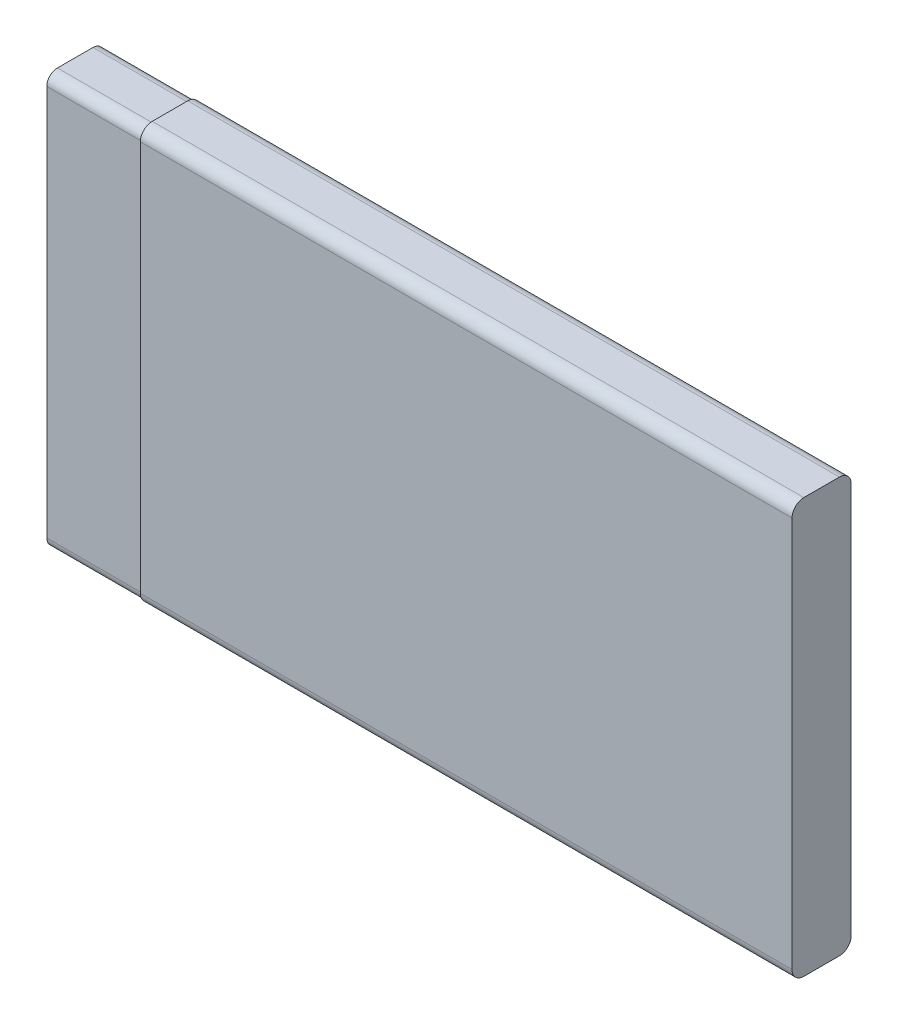
ISO-10303-21;
HEADER;
FILE_DESCRIPTION(('STEP AP214'),'2;1');
FILE_NAME('part.step','',(''),(''),'','','');
FILE_SCHEMA(('AUTOMOTIVE_DESIGN { 1 0 10303 214 1 1 1 1 }'));
ENDSEC;
DATA;
#1=APPLICATION_CONTEXT('core data for automotive mechanical design processes');
#2=APPLICATION_PROTOCOL_DEFINITION('international standard','automotive_design',2000,#1);
#3=PRODUCT_CONTEXT('',#1,'mechanical');
#4=PRODUCT('Part','Part','',(#3));
#5=PRODUCT_RELATED_PRODUCT_CATEGORY('part','',(#4));
#6=PRODUCT_DEFINITION_FORMATION('','',#4);
#7=PRODUCT_DEFINITION_CONTEXT('part definition',#1,'design');
#8=PRODUCT_DEFINITION('design','',#6,#7);
#9=PRODUCT_DEFINITION_SHAPE('','',#8);
#10=(LENGTH_UNIT() NAMED_UNIT(*) SI_UNIT(.MILLI.,.METRE.));
#11=(NAMED_UNIT(*) PLANE_ANGLE_UNIT() SI_UNIT($,.RADIAN.));
#12=(NAMED_UNIT(*) SI_UNIT($,.STERADIAN.) SOLID_ANGLE_UNIT());
#13=UNCERTAINTY_MEASURE_WITH_UNIT(LENGTH_MEASURE(1.E-05),#10,'distance_accuracy_value','');
#14=(GEOMETRIC_REPRESENTATION_CONTEXT(3) GLOBAL_UNCERTAINTY_ASSIGNED_CONTEXT((#13)) GLOBAL_UNIT_ASSIGNED_CONTEXT((#10,
#11,#12)) REPRESENTATION_CONTEXT('',''));
#15=CARTESIAN_POINT('',(0.,0.,0.));
#16=DIRECTION('',(0.,0.,1.));
#17=DIRECTION('',(1.,0.,0.));
#18=AXIS2_PLACEMENT_3D('',#15,#16,#17);
#19=CARTESIAN_POINT('',(-23.5,17.5,2.5));
#20=DIRECTION('',(1.,0.,0.));
#21=DIRECTION('',(0.,1.,0.));
#22=AXIS2_PLACEMENT_3D('',#19,#20,#21);
#23=PLANE('',#22);
#24=DIRECTION('',(0.,0.,-1.));
#25=VECTOR('',#24,1.);
#26=CARTESIAN_POINT('',(-23.5,-17.5,2.5));
#27=LINE('',#26,#25);
#28=CARTESIAN_POINT('',(-23.5,-17.5,1.5));
#29=VERTEX_POINT('',#28);
#30=CARTESIAN_POINT('',(-23.5,-17.5,-1.5));
#31=VERTEX_POINT('',#30);
#32=EDGE_CURVE('E390',#29,#31,#27,.T.);
#33=ORIENTED_EDGE('',*,*,#32,.F.);
#34=CARTESIAN_POINT('',(-23.5,-16.5,1.5));
#35=DIRECTION('',(1.,0.,0.));
#36=DIRECTION('',(0.,1.,0.));
#37=AXIS2_PLACEMENT_3D('',#34,#35,#36);
#38=CIRCLE('',#37,1.);
#39=CARTESIAN_POINT('',(-23.5,-16.5,2.5));
#40=VERTEX_POINT('',#39);
#41=EDGE_CURVE('E431',#29,#40,#38,.F.);
#42=ORIENTED_EDGE('',*,*,#41,.T.);
#43=DIRECTION('',(0.,-1.,0.));
#44=VECTOR('',#43,1.);
#45=CARTESIAN_POINT('',(-23.5,17.5,2.5));
#46=LINE('',#45,#44);
#47=CARTESIAN_POINT('',(-23.5,16.5,2.5));
#48=VERTEX_POINT('',#47);
#49=EDGE_CURVE('E386',#48,#40,#46,.T.);
#50=ORIENTED_EDGE('',*,*,#49,.F.);
#51=CARTESIAN_POINT('',(-23.5,16.5,1.5));
#52=DIRECTION('',(1.,0.,0.));
#53=DIRECTION('',(0.,1.,0.));
#54=AXIS2_PLACEMENT_3D('',#51,#52,#53);
#55=CIRCLE('',#54,1.);
#56=CARTESIAN_POINT('',(-23.5,17.5,1.5));
#57=VERTEX_POINT('',#56);
#58=EDGE_CURVE('E425',#48,#57,#55,.F.);
#59=ORIENTED_EDGE('',*,*,#58,.T.);
#60=DIRECTION('',(0.,0.,-1.));
#61=VECTOR('',#60,1.);
#62=CARTESIAN_POINT('',(-23.5,17.5,2.5));
#63=LINE('',#62,#61);
#64=CARTESIAN_POINT('',(-23.5,17.5,-1.5));
#65=VERTEX_POINT('',#64);
#66=EDGE_CURVE('E397',#57,#65,#63,.T.);
#67=ORIENTED_EDGE('',*,*,#66,.T.);
#68=CARTESIAN_POINT('',(-23.5,16.5,-1.5));
#69=DIRECTION('',(1.,0.,0.));
#70=DIRECTION('',(0.,1.,0.));
#71=AXIS2_PLACEMENT_3D('',#68,#69,#70);
#72=CIRCLE('',#71,1.);
#73=CARTESIAN_POINT('',(-23.5,16.5,-2.5));
#74=VERTEX_POINT('',#73);
#75=EDGE_CURVE('E427',#65,#74,#72,.F.);
#76=ORIENTED_EDGE('',*,*,#75,.T.);
#77=DIRECTION('',(0.,-1.,0.));
#78=VECTOR('',#77,1.);
#79=CARTESIAN_POINT('',(-23.5,17.5,-2.5));
#80=LINE('',#79,#78);
#81=CARTESIAN_POINT('',(-23.5,-16.5,-2.5));
#82=VERTEX_POINT('',#81);
#83=EDGE_CURVE('E387',#74,#82,#80,.T.);
#84=ORIENTED_EDGE('',*,*,#83,.T.);
#85=CARTESIAN_POINT('',(-23.5,-16.5,-1.5));
#86=DIRECTION('',(1.,0.,0.));
#87=DIRECTION('',(0.,1.,0.));
#88=AXIS2_PLACEMENT_3D('',#85,#86,#87);
#89=CIRCLE('',#88,1.);
#90=EDGE_CURVE('E429',#82,#31,#89,.F.);
#91=ORIENTED_EDGE('',*,*,#90,.T.);
#92=EDGE_LOOP('',(#33,#42,#50,#59,#67,#76,#84,#91));
#93=FACE_BOUND('',#92,.T.);
#94=CARTESIAN_POINT('',(-23.5,-16.5,-1.5));
#95=DIRECTION('',(-1.,0.,0.));
#96=DIRECTION('',(0.,-1.,0.));
#97=AXIS2_PLACEMENT_3D('',#94,#95,#96);
#98=CIRCLE('',#97,0.899999999999999);
#99=CARTESIAN_POINT('',(-23.5,-16.5,-2.4));
#100=VERTEX_POINT('',#99);
#101=CARTESIAN_POINT('',(-23.5,-17.4,-1.5));
#102=VERTEX_POINT('',#101);
#103=EDGE_CURVE('E239',#100,#102,#98,.T.);
#104=ORIENTED_EDGE('',*,*,#103,.F.);
#105=DIRECTION('',(0.,-1.,0.));
#106=VECTOR('',#105,1.);
#107=CARTESIAN_POINT('',(-23.5,16.5,-2.4));
#108=LINE('',#107,#106);
#109=CARTESIAN_POINT('',(-23.5,16.5,-2.4));
#110=VERTEX_POINT('',#109);
#111=EDGE_CURVE('E296',#110,#100,#108,.T.);
#112=ORIENTED_EDGE('',*,*,#111,.F.);
#113=CARTESIAN_POINT('',(-23.5,16.5,-1.5));
#114=DIRECTION('',(-1.,0.,0.));
#115=DIRECTION('',(0.,-1.,0.));
#116=AXIS2_PLACEMENT_3D('',#113,#114,#115);
#117=CIRCLE('',#116,0.900000000000001);
#118=CARTESIAN_POINT('',(-23.5,17.4,-1.5));
#119=VERTEX_POINT('',#118);
#120=EDGE_CURVE('E324',#119,#110,#117,.T.);
#121=ORIENTED_EDGE('',*,*,#120,.F.);
#122=DIRECTION('',(0.,0.,-1.));
#123=VECTOR('',#122,1.);
#124=CARTESIAN_POINT('',(-23.5,17.4,1.5));
#125=LINE('',#124,#123);
#126=CARTESIAN_POINT('',(-23.5,17.4,1.5));
#127=VERTEX_POINT('',#126);
#128=EDGE_CURVE('E321',#127,#119,#125,.T.);
#129=ORIENTED_EDGE('',*,*,#128,.F.);
#130=CARTESIAN_POINT('',(-23.5,16.5,1.5));
#131=DIRECTION('',(-1.,0.,0.));
#132=DIRECTION('',(0.,-1.,0.));
#133=AXIS2_PLACEMENT_3D('',#130,#131,#132);
#134=CIRCLE('',#133,0.900000000000001);
#135=CARTESIAN_POINT('',(-23.5,16.5,2.4));
#136=VERTEX_POINT('',#135);
#137=EDGE_CURVE('E318',#136,#127,#134,.T.);
#138=ORIENTED_EDGE('',*,*,#137,.F.);
#139=DIRECTION('',(0.,1.,0.));
#140=VECTOR('',#139,1.);
#141=CARTESIAN_POINT('',(-23.5,-16.5,2.4));
#142=LINE('',#141,#140);
#143=CARTESIAN_POINT('',(-23.5,-16.5,2.4));
#144=VERTEX_POINT('',#143);
#145=EDGE_CURVE('E315',#144,#136,#142,.T.);
#146=ORIENTED_EDGE('',*,*,#145,.F.);
#147=CARTESIAN_POINT('',(-23.5,-16.5,1.5));
#148=DIRECTION('',(-1.,0.,0.));
#149=DIRECTION('',(0.,-1.,0.));
#150=AXIS2_PLACEMENT_3D('',#147,#148,#149);
#151=CIRCLE('',#150,0.900000000000001);
#152=CARTESIAN_POINT('',(-23.5,-17.4,1.5));
#153=VERTEX_POINT('',#152);
#154=EDGE_CURVE('E57',#153,#144,#151,.T.);
#155=ORIENTED_EDGE('',*,*,#154,.F.);
#156=DIRECTION('',(0.,0.,1.));
#157=VECTOR('',#156,1.);
#158=CARTESIAN_POINT('',(-23.5,-17.4,-1.5));
#159=LINE('',#158,#157);
#160=EDGE_CURVE('E52',#102,#153,#159,.T.);
#161=ORIENTED_EDGE('',*,*,#160,.F.);
#162=EDGE_LOOP('',(#104,#112,#121,#129,#138,#146,#155,#161));
#163=FACE_BOUND('',#162,.T.);
#164=ADVANCED_FACE('F37',(#93,#163),#23,.F.);
#165=CARTESIAN_POINT('',(31.5,-17.5,2.5));
#166=DIRECTION('',(0.,1.,0.));
#167=DIRECTION('',(-1.,0.,0.));
#168=AXIS2_PLACEMENT_3D('',#165,#166,#167);
#169=PLANE('',#168);
#170=DIRECTION('',(0.,0.,-1.));
#171=VECTOR('',#170,1.);
#172=CARTESIAN_POINT('',(31.5,-17.5,2.5));
#173=LINE('',#172,#171);
#174=CARTESIAN_POINT('',(31.5,-17.5,1.5));
#175=VERTEX_POINT('',#174);
#176=CARTESIAN_POINT('',(31.5,-17.5,-1.5));
#177=VERTEX_POINT('',#176);
#178=EDGE_CURVE('E403',#175,#177,#173,.T.);
#179=ORIENTED_EDGE('',*,*,#178,.F.);
#180=DIRECTION('',(1.,0.,0.));
#181=VECTOR('',#180,1.);
#182=CARTESIAN_POINT('',(-23.5,-17.5,1.5));
#183=LINE('',#182,#181);
#184=EDGE_CURVE('E423',#175,#29,#183,.F.);
#185=ORIENTED_EDGE('',*,*,#184,.T.);
#186=ORIENTED_EDGE('',*,*,#32,.T.);
#187=DIRECTION('',(1.,0.,0.));
#188=VECTOR('',#187,1.);
#189=CARTESIAN_POINT('',(31.5,-17.5,-1.5));
#190=LINE('',#189,#188);
#191=EDGE_CURVE('E420',#31,#177,#190,.T.);
#192=ORIENTED_EDGE('',*,*,#191,.T.);
#193=EDGE_LOOP('',(#179,#185,#186,#192));
#194=FACE_BOUND('',#193,.T.);
#195=ADVANCED_FACE('F461',(#194),#169,.F.);
#196=CARTESIAN_POINT('',(31.5,17.5,2.5));
#197=DIRECTION('',(-1.,0.,0.));
#198=DIRECTION('',(0.,-1.,0.));
#199=AXIS2_PLACEMENT_3D('',#196,#197,#198);
#200=PLANE('',#199);
#201=DIRECTION('',(0.,1.,0.));
#202=VECTOR('',#201,1.);
#203=CARTESIAN_POINT('',(31.5,17.5,2.5));
#204=LINE('',#203,#202);
#205=CARTESIAN_POINT('',(31.5,-16.5,2.5));
#206=VERTEX_POINT('',#205);
#207=CARTESIAN_POINT('',(31.5,16.5,2.5));
#208=VERTEX_POINT('',#207);
#209=EDGE_CURVE('E383',#206,#208,#204,.T.);
#210=ORIENTED_EDGE('',*,*,#209,.F.);
#211=CARTESIAN_POINT('',(31.5,-16.5,1.5));
#212=DIRECTION('',(-1.,0.,0.));
#213=DIRECTION('',(0.,-1.,0.));
#214=AXIS2_PLACEMENT_3D('',#211,#212,#213);
#215=CIRCLE('',#214,1.);
#216=EDGE_CURVE('E418',#206,#175,#215,.F.);
#217=ORIENTED_EDGE('',*,*,#216,.T.);
#218=ORIENTED_EDGE('',*,*,#178,.T.);
#219=CARTESIAN_POINT('',(31.5,-16.5,-1.5));
#220=DIRECTION('',(-1.,0.,0.));
#221=DIRECTION('',(0.,-1.,0.));
#222=AXIS2_PLACEMENT_3D('',#219,#220,#221);
#223=CIRCLE('',#222,1.);
#224=CARTESIAN_POINT('',(31.5,-16.5,-2.5));
#225=VERTEX_POINT('',#224);
#226=EDGE_CURVE('E416',#177,#225,#223,.F.);
#227=ORIENTED_EDGE('',*,*,#226,.T.);
#228=DIRECTION('',(0.,1.,0.));
#229=VECTOR('',#228,1.);
#230=CARTESIAN_POINT('',(31.5,17.5,-2.5));
#231=LINE('',#230,#229);
#232=CARTESIAN_POINT('',(31.5,16.5,-2.5));
#233=VERTEX_POINT('',#232);
#234=EDGE_CURVE('E382',#225,#233,#231,.T.);
#235=ORIENTED_EDGE('',*,*,#234,.T.);
#236=CARTESIAN_POINT('',(31.5,16.5,-1.5));
#237=DIRECTION('',(-1.,0.,0.));
#238=DIRECTION('',(0.,-1.,0.));
#239=AXIS2_PLACEMENT_3D('',#236,#237,#238);
#240=CIRCLE('',#239,1.);
#241=CARTESIAN_POINT('',(31.5,17.5,-1.5));
#242=VERTEX_POINT('',#241);
#243=EDGE_CURVE('E414',#233,#242,#240,.F.);
#244=ORIENTED_EDGE('',*,*,#243,.T.);
#245=DIRECTION('',(0.,0.,-1.));
#246=VECTOR('',#245,1.);
#247=CARTESIAN_POINT('',(31.5,17.5,2.5));
#248=LINE('',#247,#246);
#249=CARTESIAN_POINT('',(31.5,17.5,1.5));
#250=VERTEX_POINT('',#249);
#251=EDGE_CURVE('E400',#250,#242,#248,.T.);
#252=ORIENTED_EDGE('',*,*,#251,.F.);
#253=CARTESIAN_POINT('',(31.5,16.5,1.5));
#254=DIRECTION('',(-1.,0.,0.));
#255=DIRECTION('',(0.,-1.,0.));
#256=AXIS2_PLACEMENT_3D('',#253,#254,#255);
#257=CIRCLE('',#256,1.);
#258=EDGE_CURVE('E412',#250,#208,#257,.F.);
#259=ORIENTED_EDGE('',*,*,#258,.T.);
#260=EDGE_LOOP('',(#210,#217,#218,#227,#235,#244,#252,#259));
#261=FACE_BOUND('',#260,.T.);
#262=ADVANCED_FACE('F446',(#261),#200,.F.);
#263=CARTESIAN_POINT('',(31.5,17.5,2.5));
#264=DIRECTION('',(0.,-1.,0.));
#265=DIRECTION('',(1.,0.,0.));
#266=AXIS2_PLACEMENT_3D('',#263,#264,#265);
#267=PLANE('',#266);
#268=ORIENTED_EDGE('',*,*,#251,.T.);
#269=DIRECTION('',(-1.,0.,0.));
#270=VECTOR('',#269,1.);
#271=CARTESIAN_POINT('',(31.5,17.5,-1.5));
#272=LINE('',#271,#270);
#273=EDGE_CURVE('E11',#242,#65,#272,.T.);
#274=ORIENTED_EDGE('',*,*,#273,.T.);
#275=ORIENTED_EDGE('',*,*,#66,.F.);
#276=DIRECTION('',(-1.,0.,0.));
#277=VECTOR('',#276,1.);
#278=CARTESIAN_POINT('',(31.5,17.5,1.5));
#279=LINE('',#278,#277);
#280=EDGE_CURVE('E45',#57,#250,#279,.F.);
#281=ORIENTED_EDGE('',*,*,#280,.T.);
#282=EDGE_LOOP('',(#268,#274,#275,#281));
#283=FACE_BOUND('',#282,.T.);
#284=ADVANCED_FACE('F440',(#283),#267,.F.);
#285=CARTESIAN_POINT('',(0.,0.,2.5));
#286=DIRECTION('',(0.,0.,1.));
#287=DIRECTION('',(1.,0.,0.));
#288=AXIS2_PLACEMENT_3D('',#285,#286,#287);
#289=PLANE('',#288);
#290=ORIENTED_EDGE('',*,*,#49,.T.);
#291=DIRECTION('',(1.,0.,0.));
#292=VECTOR('',#291,1.);
#293=CARTESIAN_POINT('',(31.5,-16.5,2.5));
#294=LINE('',#293,#292);
#295=EDGE_CURVE('E409',#40,#206,#294,.T.);
#296=ORIENTED_EDGE('',*,*,#295,.T.);
#297=ORIENTED_EDGE('',*,*,#209,.T.);
#298=DIRECTION('',(-1.,0.,0.));
#299=VECTOR('',#298,1.);
#300=CARTESIAN_POINT('',(-23.5,16.5,2.5));
#301=LINE('',#300,#299);
#302=EDGE_CURVE('E406',#208,#48,#301,.T.);
#303=ORIENTED_EDGE('',*,*,#302,.T.);
#304=EDGE_LOOP('',(#290,#296,#297,#303));
#305=FACE_BOUND('',#304,.T.);
#306=ADVANCED_FACE('F451',(#305),#289,.T.);
#307=CARTESIAN_POINT('',(0.,0.,-2.5));
#308=DIRECTION('',(0.,0.,1.));
#309=DIRECTION('',(1.,0.,0.));
#310=AXIS2_PLACEMENT_3D('',#307,#308,#309);
#311=PLANE('',#310);
#312=ORIENTED_EDGE('',*,*,#234,.F.);
#313=DIRECTION('',(1.,0.,0.));
#314=VECTOR('',#313,1.);
#315=CARTESIAN_POINT('',(0.,-16.5,-2.5));
#316=LINE('',#315,#314);
#317=EDGE_CURVE('E435',#225,#82,#316,.F.);
#318=ORIENTED_EDGE('',*,*,#317,.T.);
#319=ORIENTED_EDGE('',*,*,#83,.F.);
#320=DIRECTION('',(-1.,0.,0.));
#321=VECTOR('',#320,1.);
#322=CARTESIAN_POINT('',(0.,16.5,-2.5));
#323=LINE('',#322,#321);
#324=EDGE_CURVE('E433',#74,#233,#323,.F.);
#325=ORIENTED_EDGE('',*,*,#324,.T.);
#326=EDGE_LOOP('',(#312,#318,#319,#325));
#327=FACE_BOUND('',#326,.T.);
#328=ADVANCED_FACE('F469',(#327),#311,.F.);
#329=CARTESIAN_POINT('',(0.,-16.5,1.5));
#330=DIRECTION('',(-1.,0.,0.));
#331=DIRECTION('',(0.,-1.,0.));
#332=AXIS2_PLACEMENT_3D('',#329,#330,#331);
#333=CYLINDRICAL_SURFACE('',#332,1.);
#334=ORIENTED_EDGE('',*,*,#41,.F.);
#335=ORIENTED_EDGE('',*,*,#184,.F.);
#336=ORIENTED_EDGE('',*,*,#216,.F.);
#337=ORIENTED_EDGE('',*,*,#295,.F.);
#338=EDGE_LOOP('',(#334,#335,#336,#337));
#339=FACE_BOUND('',#338,.T.);
#340=ADVANCED_FACE('F458',(#339),#333,.T.);
#341=CARTESIAN_POINT('',(31.5,-16.5,-1.5));
#342=DIRECTION('',(1.,0.,0.));
#343=DIRECTION('',(0.,1.,0.));
#344=AXIS2_PLACEMENT_3D('',#341,#342,#343);
#345=CYLINDRICAL_SURFACE('',#344,1.);
#346=ORIENTED_EDGE('',*,*,#90,.F.);
#347=ORIENTED_EDGE('',*,*,#317,.F.);
#348=ORIENTED_EDGE('',*,*,#226,.F.);
#349=ORIENTED_EDGE('',*,*,#191,.F.);
#350=EDGE_LOOP('',(#346,#347,#348,#349));
#351=FACE_BOUND('',#350,.T.);
#352=ADVANCED_FACE('F465',(#351),#345,.T.);
#353=CARTESIAN_POINT('',(31.5,16.5,-1.5));
#354=DIRECTION('',(-1.,0.,0.));
#355=DIRECTION('',(0.,-1.,0.));
#356=AXIS2_PLACEMENT_3D('',#353,#354,#355);
#357=CYLINDRICAL_SURFACE('',#356,1.);
#358=ORIENTED_EDGE('',*,*,#243,.F.);
#359=ORIENTED_EDGE('',*,*,#324,.F.);
#360=ORIENTED_EDGE('',*,*,#75,.F.);
#361=ORIENTED_EDGE('',*,*,#273,.F.);
#362=EDGE_LOOP('',(#358,#359,#360,#361));
#363=FACE_BOUND('',#362,.T.);
#364=ADVANCED_FACE('F473',(#363),#357,.T.);
#365=CARTESIAN_POINT('',(0.,16.5,1.5));
#366=DIRECTION('',(1.,0.,0.));
#367=DIRECTION('',(0.,1.,0.));
#368=AXIS2_PLACEMENT_3D('',#365,#366,#367);
#369=CYLINDRICAL_SURFACE('',#368,1.);
#370=ORIENTED_EDGE('',*,*,#258,.F.);
#371=ORIENTED_EDGE('',*,*,#280,.F.);
#372=ORIENTED_EDGE('',*,*,#58,.F.);
#373=ORIENTED_EDGE('',*,*,#302,.F.);
#374=EDGE_LOOP('',(#370,#371,#372,#373));
#375=FACE_BOUND('',#374,.T.);
#376=ADVANCED_FACE('F39',(#375),#369,.T.);
#377=CARTESIAN_POINT('',(-31.5,-16.5,-1.5));
#378=DIRECTION('',(-1.,0.,0.));
#379=DIRECTION('',(0.,-1.,0.));
#380=AXIS2_PLACEMENT_3D('',#377,#378,#379);
#381=PLANE('',#380);
#382=CARTESIAN_POINT('',(-31.5,-16.5,-1.5));
#383=DIRECTION('',(-1.,0.,0.));
#384=DIRECTION('',(0.,-1.,0.));
#385=AXIS2_PLACEMENT_3D('',#382,#383,#384);
#386=CIRCLE('',#385,0.899999999999999);
#387=CARTESIAN_POINT('',(-31.5,-16.5,-2.4));
#388=VERTEX_POINT('',#387);
#389=CARTESIAN_POINT('',(-31.5,-17.4,-1.5));
#390=VERTEX_POINT('',#389);
#391=EDGE_CURVE('E292',#388,#390,#386,.T.);
#392=ORIENTED_EDGE('',*,*,#391,.T.);
#393=DIRECTION('',(0.,0.,1.));
#394=VECTOR('',#393,1.);
#395=CARTESIAN_POINT('',(-31.5,-17.4,-1.5));
#396=LINE('',#395,#394);
#397=CARTESIAN_POINT('',(-31.5,-17.4,1.5));
#398=VERTEX_POINT('',#397);
#399=EDGE_CURVE('E295',#390,#398,#396,.T.);
#400=ORIENTED_EDGE('',*,*,#399,.T.);
#401=CARTESIAN_POINT('',(-31.5,-16.5,1.5));
#402=DIRECTION('',(-1.,0.,0.));
#403=DIRECTION('',(0.,-1.,0.));
#404=AXIS2_PLACEMENT_3D('',#401,#402,#403);
#405=CIRCLE('',#404,0.900000000000001);
#406=CARTESIAN_POINT('',(-31.5,-16.5,2.4));
#407=VERTEX_POINT('',#406);
#408=EDGE_CURVE('E298',#398,#407,#405,.T.);
#409=ORIENTED_EDGE('',*,*,#408,.T.);
#410=DIRECTION('',(0.,1.,0.));
#411=VECTOR('',#410,1.);
#412=CARTESIAN_POINT('',(-31.5,-16.5,2.4));
#413=LINE('',#412,#411);
#414=CARTESIAN_POINT('',(-31.5,16.5,2.4));
#415=VERTEX_POINT('',#414);
#416=EDGE_CURVE('E300',#407,#415,#413,.T.);
#417=ORIENTED_EDGE('',*,*,#416,.T.);
#418=CARTESIAN_POINT('',(-31.5,16.5,1.5));
#419=DIRECTION('',(-1.,0.,0.));
#420=DIRECTION('',(0.,-1.,0.));
#421=AXIS2_PLACEMENT_3D('',#418,#419,#420);
#422=CIRCLE('',#421,0.900000000000001);
#423=CARTESIAN_POINT('',(-31.5,17.4,1.5));
#424=VERTEX_POINT('',#423);
#425=EDGE_CURVE('E302',#415,#424,#422,.T.);
#426=ORIENTED_EDGE('',*,*,#425,.T.);
#427=DIRECTION('',(0.,0.,-1.));
#428=VECTOR('',#427,1.);
#429=CARTESIAN_POINT('',(-31.5,17.4,1.5));
#430=LINE('',#429,#428);
#431=CARTESIAN_POINT('',(-31.5,17.4,-1.5));
#432=VERTEX_POINT('',#431);
#433=EDGE_CURVE('E304',#424,#432,#430,.T.);
#434=ORIENTED_EDGE('',*,*,#433,.T.);
#435=CARTESIAN_POINT('',(-31.5,16.5,-1.5));
#436=DIRECTION('',(-1.,0.,0.));
#437=DIRECTION('',(0.,-1.,0.));
#438=AXIS2_PLACEMENT_3D('',#435,#436,#437);
#439=CIRCLE('',#438,0.900000000000001);
#440=CARTESIAN_POINT('',(-31.5,16.5,-2.4));
#441=VERTEX_POINT('',#440);
#442=EDGE_CURVE('E306',#432,#441,#439,.T.);
#443=ORIENTED_EDGE('',*,*,#442,.T.);
#444=DIRECTION('',(0.,-1.,0.));
#445=VECTOR('',#444,1.);
#446=CARTESIAN_POINT('',(-31.5,16.5,-2.4));
#447=LINE('',#446,#445);
#448=EDGE_CURVE('E308',#441,#388,#447,.T.);
#449=ORIENTED_EDGE('',*,*,#448,.T.);
#450=EDGE_LOOP('',(#392,#400,#409,#417,#426,#434,#443,#449));
#451=FACE_BOUND('',#450,.T.);
#452=DIRECTION('',(0.,0.,1.));
#453=VECTOR('',#452,1.);
#454=CARTESIAN_POINT('',(-31.5,-17.3,-1.5));
#455=LINE('',#454,#453);
#456=CARTESIAN_POINT('',(-31.5,-17.3,-1.5));
#457=VERTEX_POINT('',#456);
#458=CARTESIAN_POINT('',(-31.5,-17.3,1.5));
#459=VERTEX_POINT('',#458);
#460=EDGE_CURVE('E231',#457,#459,#455,.T.);
#461=ORIENTED_EDGE('',*,*,#460,.F.);
#462=CARTESIAN_POINT('',(-31.5,-16.5,-1.5));
#463=DIRECTION('',(-1.,0.,0.));
#464=DIRECTION('',(0.,-1.,0.));
#465=AXIS2_PLACEMENT_3D('',#462,#463,#464);
#466=CIRCLE('',#465,0.799999999999999);
#467=CARTESIAN_POINT('',(-31.5,-16.5,-2.3));
#468=VERTEX_POINT('',#467);
#469=EDGE_CURVE('E221',#468,#457,#466,.T.);
#470=ORIENTED_EDGE('',*,*,#469,.F.);
#471=DIRECTION('',(0.,-1.,0.));
#472=VECTOR('',#471,1.);
#473=CARTESIAN_POINT('',(-31.5,16.5,-2.3));
#474=LINE('',#473,#472);
#475=CARTESIAN_POINT('',(-31.5,16.5,-2.3));
#476=VERTEX_POINT('',#475);
#477=EDGE_CURVE('E258',#476,#468,#474,.T.);
#478=ORIENTED_EDGE('',*,*,#477,.F.);
#479=CARTESIAN_POINT('',(-31.5,16.5,-1.5));
#480=DIRECTION('',(-1.,0.,0.));
#481=DIRECTION('',(0.,-1.,0.));
#482=AXIS2_PLACEMENT_3D('',#479,#480,#481);
#483=CIRCLE('',#482,0.800000000000001);
#484=CARTESIAN_POINT('',(-31.5,17.3,-1.5));
#485=VERTEX_POINT('',#484);
#486=EDGE_CURVE('E255',#485,#476,#483,.T.);
#487=ORIENTED_EDGE('',*,*,#486,.F.);
#488=DIRECTION('',(0.,0.,-1.));
#489=VECTOR('',#488,1.);
#490=CARTESIAN_POINT('',(-31.5,17.3,1.5));
#491=LINE('',#490,#489);
#492=CARTESIAN_POINT('',(-31.5,17.3,1.5));
#493=VERTEX_POINT('',#492);
#494=EDGE_CURVE('E253',#493,#485,#491,.T.);
#495=ORIENTED_EDGE('',*,*,#494,.F.);
#496=CARTESIAN_POINT('',(-31.5,16.5,1.5));
#497=DIRECTION('',(-1.,0.,0.));
#498=DIRECTION('',(0.,-1.,0.));
#499=AXIS2_PLACEMENT_3D('',#496,#497,#498);
#500=CIRCLE('',#499,0.8);
#501=CARTESIAN_POINT('',(-31.5,16.5,2.3));
#502=VERTEX_POINT('',#501);
#503=EDGE_CURVE('E251',#502,#493,#500,.T.);
#504=ORIENTED_EDGE('',*,*,#503,.F.);
#505=DIRECTION('',(0.,1.,0.));
#506=VECTOR('',#505,1.);
#507=CARTESIAN_POINT('',(-31.5,-16.5,2.3));
#508=LINE('',#507,#506);
#509=CARTESIAN_POINT('',(-31.5,-16.5,2.3));
#510=VERTEX_POINT('',#509);
#511=EDGE_CURVE('E247',#510,#502,#508,.T.);
#512=ORIENTED_EDGE('',*,*,#511,.F.);
#513=CARTESIAN_POINT('',(-31.5,-16.5,1.5));
#514=DIRECTION('',(-1.,0.,0.));
#515=DIRECTION('',(0.,-1.,0.));
#516=AXIS2_PLACEMENT_3D('',#513,#514,#515);
#517=CIRCLE('',#516,0.800000000000001);
#518=EDGE_CURVE('E245',#459,#510,#517,.T.);
#519=ORIENTED_EDGE('',*,*,#518,.F.);
#520=EDGE_LOOP('',(#461,#470,#478,#487,#495,#504,#512,#519));
#521=FACE_BOUND('',#520,.T.);
#522=ADVANCED_FACE('F243',(#451,#521),#381,.T.);
#523=CARTESIAN_POINT('',(-31.5,-16.5,-1.5));
#524=DIRECTION('',(1.,0.,0.));
#525=DIRECTION('',(0.,1.,0.));
#526=AXIS2_PLACEMENT_3D('',#523,#524,#525);
#527=CYLINDRICAL_SURFACE('',#526,0.899999999999999);
#528=ORIENTED_EDGE('',*,*,#103,.T.);
#529=DIRECTION('',(1.,0.,0.));
#530=VECTOR('',#529,1.);
#531=CARTESIAN_POINT('',(-31.5,-17.4,-1.5));
#532=LINE('',#531,#530);
#533=EDGE_CURVE('E349',#390,#102,#532,.T.);
#534=ORIENTED_EDGE('',*,*,#533,.F.);
#535=ORIENTED_EDGE('',*,*,#391,.F.);
#536=DIRECTION('',(1.,0.,0.));
#537=VECTOR('',#536,1.);
#538=CARTESIAN_POINT('',(-31.5,-16.5,-2.4));
#539=LINE('',#538,#537);
#540=EDGE_CURVE('E310',#388,#100,#539,.T.);
#541=ORIENTED_EDGE('',*,*,#540,.T.);
#542=EDGE_LOOP('',(#528,#534,#535,#541));
#543=FACE_BOUND('',#542,.T.);
#544=ADVANCED_FACE('F527',(#543),#527,.T.);
#545=CARTESIAN_POINT('',(-31.5,-17.4,-1.5));
#546=DIRECTION('',(0.,1.,0.));
#547=DIRECTION('',(-1.,0.,0.));
#548=AXIS2_PLACEMENT_3D('',#545,#546,#547);
#549=PLANE('',#548);
#550=ORIENTED_EDGE('',*,*,#160,.T.);
#551=DIRECTION('',(1.,0.,0.));
#552=VECTOR('',#551,1.);
#553=CARTESIAN_POINT('',(-31.5,-17.4,1.5));
#554=LINE('',#553,#552);
#555=EDGE_CURVE('E346',#398,#153,#554,.T.);
#556=ORIENTED_EDGE('',*,*,#555,.F.);
#557=ORIENTED_EDGE('',*,*,#399,.F.);
#558=ORIENTED_EDGE('',*,*,#533,.T.);
#559=EDGE_LOOP('',(#550,#556,#557,#558));
#560=FACE_BOUND('',#559,.T.);
#561=ADVANCED_FACE('F627',(#560),#549,.F.);
#562=CARTESIAN_POINT('',(-31.5,-16.5,1.5));
#563=DIRECTION('',(1.,0.,0.));
#564=DIRECTION('',(0.,1.,0.));
#565=AXIS2_PLACEMENT_3D('',#562,#563,#564);
#566=CYLINDRICAL_SURFACE('',#565,0.900000000000001);
#567=ORIENTED_EDGE('',*,*,#154,.T.);
#568=DIRECTION('',(1.,0.,0.));
#569=VECTOR('',#568,1.);
#570=CARTESIAN_POINT('',(-31.5,-16.5,2.4));
#571=LINE('',#570,#569);
#572=EDGE_CURVE('E343',#407,#144,#571,.T.);
#573=ORIENTED_EDGE('',*,*,#572,.F.);
#574=ORIENTED_EDGE('',*,*,#408,.F.);
#575=ORIENTED_EDGE('',*,*,#555,.T.);
#576=EDGE_LOOP('',(#567,#573,#574,#575));
#577=FACE_BOUND('',#576,.T.);
#578=ADVANCED_FACE('F636',(#577),#566,.T.);
#579=CARTESIAN_POINT('',(-31.5,-16.5,2.4));
#580=DIRECTION('',(0.,0.,-1.));
#581=DIRECTION('',(-1.,0.,0.));
#582=AXIS2_PLACEMENT_3D('',#579,#580,#581);
#583=PLANE('',#582);
#584=ORIENTED_EDGE('',*,*,#145,.T.);
#585=DIRECTION('',(1.,0.,0.));
#586=VECTOR('',#585,1.);
#587=CARTESIAN_POINT('',(-31.5,16.5,2.4));
#588=LINE('',#587,#586);
#589=EDGE_CURVE('E340',#415,#136,#588,.T.);
#590=ORIENTED_EDGE('',*,*,#589,.F.);
#591=ORIENTED_EDGE('',*,*,#416,.F.);
#592=ORIENTED_EDGE('',*,*,#572,.T.);
#593=EDGE_LOOP('',(#584,#590,#591,#592));
#594=FACE_BOUND('',#593,.T.);
#595=ADVANCED_FACE('F645',(#594),#583,.F.);
#596=CARTESIAN_POINT('',(-31.5,16.5,1.5));
#597=DIRECTION('',(1.,0.,0.));
#598=DIRECTION('',(0.,1.,0.));
#599=AXIS2_PLACEMENT_3D('',#596,#597,#598);
#600=CYLINDRICAL_SURFACE('',#599,0.900000000000001);
#601=ORIENTED_EDGE('',*,*,#137,.T.);
#602=DIRECTION('',(1.,0.,0.));
#603=VECTOR('',#602,1.);
#604=CARTESIAN_POINT('',(-31.5,17.4,1.5));
#605=LINE('',#604,#603);
#606=EDGE_CURVE('E337',#424,#127,#605,.T.);
#607=ORIENTED_EDGE('',*,*,#606,.F.);
#608=ORIENTED_EDGE('',*,*,#425,.F.);
#609=ORIENTED_EDGE('',*,*,#589,.T.);
#610=EDGE_LOOP('',(#601,#607,#608,#609));
#611=FACE_BOUND('',#610,.T.);
#612=ADVANCED_FACE('F655',(#611),#600,.T.);
#613=CARTESIAN_POINT('',(-31.5,17.4,1.5));
#614=DIRECTION('',(0.,-1.,0.));
#615=DIRECTION('',(1.,0.,0.));
#616=AXIS2_PLACEMENT_3D('',#613,#614,#615);
#617=PLANE('',#616);
#618=ORIENTED_EDGE('',*,*,#128,.T.);
#619=DIRECTION('',(1.,0.,0.));
#620=VECTOR('',#619,1.);
#621=CARTESIAN_POINT('',(-31.5,17.4,-1.5));
#622=LINE('',#621,#620);
#623=EDGE_CURVE('E334',#432,#119,#622,.T.);
#624=ORIENTED_EDGE('',*,*,#623,.F.);
#625=ORIENTED_EDGE('',*,*,#433,.F.);
#626=ORIENTED_EDGE('',*,*,#606,.T.);
#627=EDGE_LOOP('',(#618,#624,#625,#626));
#628=FACE_BOUND('',#627,.T.);
#629=ADVANCED_FACE('F665',(#628),#617,.F.);
#630=CARTESIAN_POINT('',(-31.5,16.5,-1.5));
#631=DIRECTION('',(1.,0.,0.));
#632=DIRECTION('',(0.,1.,0.));
#633=AXIS2_PLACEMENT_3D('',#630,#631,#632);
#634=CYLINDRICAL_SURFACE('',#633,0.900000000000001);
#635=ORIENTED_EDGE('',*,*,#120,.T.);
#636=DIRECTION('',(1.,0.,0.));
#637=VECTOR('',#636,1.);
#638=CARTESIAN_POINT('',(-31.5,16.5,-2.4));
#639=LINE('',#638,#637);
#640=EDGE_CURVE('E331',#441,#110,#639,.T.);
#641=ORIENTED_EDGE('',*,*,#640,.F.);
#642=ORIENTED_EDGE('',*,*,#442,.F.);
#643=ORIENTED_EDGE('',*,*,#623,.T.);
#644=EDGE_LOOP('',(#635,#641,#642,#643));
#645=FACE_BOUND('',#644,.T.);
#646=ADVANCED_FACE('F675',(#645),#634,.T.);
#647=CARTESIAN_POINT('',(-31.5,16.5,-2.4));
#648=DIRECTION('',(0.,0.,1.));
#649=DIRECTION('',(0.,-1.,0.));
#650=AXIS2_PLACEMENT_3D('',#647,#648,#649);
#651=PLANE('',#650);
#652=ORIENTED_EDGE('',*,*,#111,.T.);
#653=ORIENTED_EDGE('',*,*,#540,.F.);
#654=ORIENTED_EDGE('',*,*,#448,.F.);
#655=ORIENTED_EDGE('',*,*,#640,.T.);
#656=EDGE_LOOP('',(#652,#653,#654,#655));
#657=FACE_BOUND('',#656,.T.);
#658=ADVANCED_FACE('F685',(#657),#651,.F.);
#659=CARTESIAN_POINT('',(-31.5,-16.5,-1.5));
#660=DIRECTION('',(1.,0.,0.));
#661=DIRECTION('',(0.,1.,0.));
#662=AXIS2_PLACEMENT_3D('',#659,#660,#661);
#663=CYLINDRICAL_SURFACE('',#662,0.799999999999999);
#664=CARTESIAN_POINT('',(-23.5,-16.5,-1.5));
#665=DIRECTION('',(-1.,0.,0.));
#666=DIRECTION('',(0.,-1.,0.));
#667=AXIS2_PLACEMENT_3D('',#664,#665,#666);
#668=CIRCLE('',#667,0.799999999999999);
#669=CARTESIAN_POINT('',(-23.5,-16.5,-2.3));
#670=VERTEX_POINT('',#669);
#671=CARTESIAN_POINT('',(-23.5,-17.3,-1.5));
#672=VERTEX_POINT('',#671);
#673=EDGE_CURVE('E260',#670,#672,#668,.T.);
#674=ORIENTED_EDGE('',*,*,#673,.F.);
#675=DIRECTION('',(1.,0.,0.));
#676=VECTOR('',#675,1.);
#677=CARTESIAN_POINT('',(-31.5,-16.5,-2.3));
#678=LINE('',#677,#676);
#679=EDGE_CURVE('E227',#468,#670,#678,.T.);
#680=ORIENTED_EDGE('',*,*,#679,.F.);
#681=ORIENTED_EDGE('',*,*,#469,.T.);
#682=DIRECTION('',(1.,0.,0.));
#683=VECTOR('',#682,1.);
#684=CARTESIAN_POINT('',(-31.5,-17.3,-1.5));
#685=LINE('',#684,#683);
#686=EDGE_CURVE('E225',#457,#672,#685,.T.);
#687=ORIENTED_EDGE('',*,*,#686,.T.);
#688=EDGE_LOOP('',(#674,#680,#681,#687));
#689=FACE_BOUND('',#688,.T.);
#690=ADVANCED_FACE('F224',(#689),#663,.F.);
#691=CARTESIAN_POINT('',(-31.5,-17.3,-1.5));
#692=DIRECTION('',(0.,1.,0.));
#693=DIRECTION('',(-1.,0.,0.));
#694=AXIS2_PLACEMENT_3D('',#691,#692,#693);
#695=PLANE('',#694);
#696=DIRECTION('',(0.,0.,1.));
#697=VECTOR('',#696,1.);
#698=CARTESIAN_POINT('',(-23.5,-17.3,-1.5));
#699=LINE('',#698,#697);
#700=CARTESIAN_POINT('',(-23.5,-17.3,1.5));
#701=VERTEX_POINT('',#700);
#702=EDGE_CURVE('E238',#672,#701,#699,.T.);
#703=ORIENTED_EDGE('',*,*,#702,.F.);
#704=ORIENTED_EDGE('',*,*,#686,.F.);
#705=ORIENTED_EDGE('',*,*,#460,.T.);
#706=DIRECTION('',(1.,0.,0.));
#707=VECTOR('',#706,1.);
#708=CARTESIAN_POINT('',(-31.5,-17.3,1.5));
#709=LINE('',#708,#707);
#710=EDGE_CURVE('E240',#459,#701,#709,.T.);
#711=ORIENTED_EDGE('',*,*,#710,.T.);
#712=EDGE_LOOP('',(#703,#704,#705,#711));
#713=FACE_BOUND('',#712,.T.);
#714=ADVANCED_FACE('F235',(#713),#695,.T.);
#715=CARTESIAN_POINT('',(-31.5,-16.5,1.5));
#716=DIRECTION('',(1.,0.,0.));
#717=DIRECTION('',(0.,1.,0.));
#718=AXIS2_PLACEMENT_3D('',#715,#716,#717);
#719=CYLINDRICAL_SURFACE('',#718,0.800000000000001);
#720=CARTESIAN_POINT('',(-23.5,-16.5,1.5));
#721=DIRECTION('',(-1.,0.,0.));
#722=DIRECTION('',(0.,-1.,0.));
#723=AXIS2_PLACEMENT_3D('',#720,#721,#722);
#724=CIRCLE('',#723,0.800000000000001);
#725=CARTESIAN_POINT('',(-23.5,-16.5,2.3));
#726=VERTEX_POINT('',#725);
#727=EDGE_CURVE('E263',#701,#726,#724,.T.);
#728=ORIENTED_EDGE('',*,*,#727,.F.);
#729=ORIENTED_EDGE('',*,*,#710,.F.);
#730=ORIENTED_EDGE('',*,*,#518,.T.);
#731=DIRECTION('',(1.,0.,0.));
#732=VECTOR('',#731,1.);
#733=CARTESIAN_POINT('',(-31.5,-16.5,2.3));
#734=LINE('',#733,#732);
#735=EDGE_CURVE('E289',#510,#726,#734,.T.);
#736=ORIENTED_EDGE('',*,*,#735,.T.);
#737=EDGE_LOOP('',(#728,#729,#730,#736));
#738=FACE_BOUND('',#737,.T.);
#739=ADVANCED_FACE('F712',(#738),#719,.F.);
#740=CARTESIAN_POINT('',(-31.5,-16.5,2.3));
#741=DIRECTION('',(0.,0.,-1.));
#742=DIRECTION('',(-1.,0.,0.));
#743=AXIS2_PLACEMENT_3D('',#740,#741,#742);
#744=PLANE('',#743);
#745=DIRECTION('',(0.,1.,0.));
#746=VECTOR('',#745,1.);
#747=CARTESIAN_POINT('',(-23.5,-16.5,2.3));
#748=LINE('',#747,#746);
#749=CARTESIAN_POINT('',(-23.5,16.5,2.3));
#750=VERTEX_POINT('',#749);
#751=EDGE_CURVE('E266',#726,#750,#748,.T.);
#752=ORIENTED_EDGE('',*,*,#751,.F.);
#753=ORIENTED_EDGE('',*,*,#735,.F.);
#754=ORIENTED_EDGE('',*,*,#511,.T.);
#755=DIRECTION('',(1.,0.,0.));
#756=VECTOR('',#755,1.);
#757=CARTESIAN_POINT('',(-31.5,16.5,2.3));
#758=LINE('',#757,#756);
#759=EDGE_CURVE('E287',#502,#750,#758,.T.);
#760=ORIENTED_EDGE('',*,*,#759,.T.);
#761=EDGE_LOOP('',(#752,#753,#754,#760));
#762=FACE_BOUND('',#761,.T.);
#763=ADVANCED_FACE('F721',(#762),#744,.T.);
#764=CARTESIAN_POINT('',(-31.5,16.5,1.5));
#765=DIRECTION('',(1.,0.,0.));
#766=DIRECTION('',(0.,1.,0.));
#767=AXIS2_PLACEMENT_3D('',#764,#765,#766);
#768=CYLINDRICAL_SURFACE('',#767,0.8);
#769=CARTESIAN_POINT('',(-23.5,16.5,1.5));
#770=DIRECTION('',(-1.,0.,0.));
#771=DIRECTION('',(0.,-1.,0.));
#772=AXIS2_PLACEMENT_3D('',#769,#770,#771);
#773=CIRCLE('',#772,0.8);
#774=CARTESIAN_POINT('',(-23.5,17.3,1.5));
#775=VERTEX_POINT('',#774);
#776=EDGE_CURVE('E269',#750,#775,#773,.T.);
#777=ORIENTED_EDGE('',*,*,#776,.F.);
#778=ORIENTED_EDGE('',*,*,#759,.F.);
#779=ORIENTED_EDGE('',*,*,#503,.T.);
#780=DIRECTION('',(1.,0.,0.));
#781=VECTOR('',#780,1.);
#782=CARTESIAN_POINT('',(-31.5,17.3,1.5));
#783=LINE('',#782,#781);
#784=EDGE_CURVE('E285',#493,#775,#783,.T.);
#785=ORIENTED_EDGE('',*,*,#784,.T.);
#786=EDGE_LOOP('',(#777,#778,#779,#785));
#787=FACE_BOUND('',#786,.T.);
#788=ADVANCED_FACE('F731',(#787),#768,.F.);
#789=CARTESIAN_POINT('',(-31.5,17.3,1.5));
#790=DIRECTION('',(0.,-1.,0.));
#791=DIRECTION('',(0.,0.,-1.));
#792=AXIS2_PLACEMENT_3D('',#789,#790,#791);
#793=PLANE('',#792);
#794=DIRECTION('',(0.,0.,-1.));
#795=VECTOR('',#794,1.);
#796=CARTESIAN_POINT('',(-23.5,17.3,1.5));
#797=LINE('',#796,#795);
#798=CARTESIAN_POINT('',(-23.5,17.3,-1.5));
#799=VERTEX_POINT('',#798);
#800=EDGE_CURVE('E272',#775,#799,#797,.T.);
#801=ORIENTED_EDGE('',*,*,#800,.F.);
#802=ORIENTED_EDGE('',*,*,#784,.F.);
#803=ORIENTED_EDGE('',*,*,#494,.T.);
#804=DIRECTION('',(1.,0.,0.));
#805=VECTOR('',#804,1.);
#806=CARTESIAN_POINT('',(-31.5,17.3,-1.5));
#807=LINE('',#806,#805);
#808=EDGE_CURVE('E283',#485,#799,#807,.T.);
#809=ORIENTED_EDGE('',*,*,#808,.T.);
#810=EDGE_LOOP('',(#801,#802,#803,#809));
#811=FACE_BOUND('',#810,.T.);
#812=ADVANCED_FACE('F741',(#811),#793,.T.);
#813=CARTESIAN_POINT('',(-31.5,16.5,-1.5));
#814=DIRECTION('',(1.,0.,0.));
#815=DIRECTION('',(0.,1.,0.));
#816=AXIS2_PLACEMENT_3D('',#813,#814,#815);
#817=CYLINDRICAL_SURFACE('',#816,0.800000000000001);
#818=CARTESIAN_POINT('',(-23.5,16.5,-1.5));
#819=DIRECTION('',(-1.,0.,0.));
#820=DIRECTION('',(0.,-1.,0.));
#821=AXIS2_PLACEMENT_3D('',#818,#819,#820);
#822=CIRCLE('',#821,0.800000000000001);
#823=CARTESIAN_POINT('',(-23.5,16.5,-2.3));
#824=VERTEX_POINT('',#823);
#825=EDGE_CURVE('E275',#799,#824,#822,.T.);
#826=ORIENTED_EDGE('',*,*,#825,.F.);
#827=ORIENTED_EDGE('',*,*,#808,.F.);
#828=ORIENTED_EDGE('',*,*,#486,.T.);
#829=DIRECTION('',(1.,0.,0.));
#830=VECTOR('',#829,1.);
#831=CARTESIAN_POINT('',(-31.5,16.5,-2.3));
#832=LINE('',#831,#830);
#833=EDGE_CURVE('E281',#476,#824,#832,.T.);
#834=ORIENTED_EDGE('',*,*,#833,.T.);
#835=EDGE_LOOP('',(#826,#827,#828,#834));
#836=FACE_BOUND('',#835,.T.);
#837=ADVANCED_FACE('F751',(#836),#817,.F.);
#838=CARTESIAN_POINT('',(-31.5,16.5,-2.3));
#839=DIRECTION('',(0.,0.,1.));
#840=DIRECTION('',(0.,-1.,0.));
#841=AXIS2_PLACEMENT_3D('',#838,#839,#840);
#842=PLANE('',#841);
#843=DIRECTION('',(0.,-1.,0.));
#844=VECTOR('',#843,1.);
#845=CARTESIAN_POINT('',(-23.5,16.5,-2.3));
#846=LINE('',#845,#844);
#847=EDGE_CURVE('E232',#824,#670,#846,.T.);
#848=ORIENTED_EDGE('',*,*,#847,.F.);
#849=ORIENTED_EDGE('',*,*,#833,.F.);
#850=ORIENTED_EDGE('',*,*,#477,.T.);
#851=ORIENTED_EDGE('',*,*,#679,.T.);
#852=EDGE_LOOP('',(#848,#849,#850,#851));
#853=FACE_BOUND('',#852,.T.);
#854=ADVANCED_FACE('F523',(#853),#842,.T.);
#855=CARTESIAN_POINT('',(-29.,16.5,0.8));
#856=DIRECTION('',(1.,0.,0.));
#857=DIRECTION('',(0.,1.,0.));
#858=AXIS2_PLACEMENT_3D('',#855,#856,#857);
#859=PLANE('',#858);
#860=DIRECTION('',(0.,-1.,0.));
#861=VECTOR('',#860,1.);
#862=CARTESIAN_POINT('',(-29.,16.5,-0.8));
#863=LINE('',#862,#861);
#864=CARTESIAN_POINT('',(-29.,16.5,-0.8));
#865=VERTEX_POINT('',#864);
#866=CARTESIAN_POINT('',(-29.,-16.5,-0.8));
#867=VERTEX_POINT('',#866);
#868=EDGE_CURVE('E351',#865,#867,#863,.T.);
#869=ORIENTED_EDGE('',*,*,#868,.T.);
#870=DIRECTION('',(0.,0.,-1.));
#871=VECTOR('',#870,1.);
#872=CARTESIAN_POINT('',(-29.,-16.5,0.8));
#873=LINE('',#872,#871);
#874=CARTESIAN_POINT('',(-29.,-16.5,0.8));
#875=VERTEX_POINT('',#874);
#876=EDGE_CURVE('E379',#875,#867,#873,.T.);
#877=ORIENTED_EDGE('',*,*,#876,.F.);
#878=DIRECTION('',(0.,-1.,0.));
#879=VECTOR('',#878,1.);
#880=CARTESIAN_POINT('',(-29.,16.5,0.8));
#881=LINE('',#880,#879);
#882=CARTESIAN_POINT('',(-29.,16.5,0.8));
#883=VERTEX_POINT('',#882);
#884=EDGE_CURVE('E352',#883,#875,#881,.T.);
#885=ORIENTED_EDGE('',*,*,#884,.F.);
#886=DIRECTION('',(0.,0.,-1.));
#887=VECTOR('',#886,1.);
#888=CARTESIAN_POINT('',(-29.,16.5,0.8));
#889=LINE('',#888,#887);
#890=EDGE_CURVE('E362',#883,#865,#889,.T.);
#891=ORIENTED_EDGE('',*,*,#890,.T.);
#892=EDGE_LOOP('',(#869,#877,#885,#891));
#893=FACE_BOUND('',#892,.T.);
#894=ADVANCED_FACE('F513',(#893),#859,.F.);
#895=CARTESIAN_POINT('',(0.,0.,0.8));
#896=DIRECTION('',(0.,0.,1.));
#897=DIRECTION('',(1.,0.,0.));
#898=AXIS2_PLACEMENT_3D('',#895,#896,#897);
#899=PLANE('',#898);
#900=ORIENTED_EDGE('',*,*,#884,.T.);
#901=DIRECTION('',(1.,0.,0.));
#902=VECTOR('',#901,1.);
#903=CARTESIAN_POINT('',(-29.,-16.5,0.8));
#904=LINE('',#903,#902);
#905=CARTESIAN_POINT('',(-23.5,-16.5,0.8));
#906=VERTEX_POINT('',#905);
#907=EDGE_CURVE('E355',#875,#906,#904,.T.);
#908=ORIENTED_EDGE('',*,*,#907,.T.);
#909=DIRECTION('',(0.,1.,0.));
#910=VECTOR('',#909,1.);
#911=CARTESIAN_POINT('',(-23.5,16.5,0.8));
#912=LINE('',#911,#910);
#913=CARTESIAN_POINT('',(-23.5,16.5,0.8));
#914=VERTEX_POINT('',#913);
#915=EDGE_CURVE('E358',#906,#914,#912,.T.);
#916=ORIENTED_EDGE('',*,*,#915,.T.);
#917=DIRECTION('',(-1.,0.,0.));
#918=VECTOR('',#917,1.);
#919=CARTESIAN_POINT('',(-29.,16.5,0.8));
#920=LINE('',#919,#918);
#921=EDGE_CURVE('E360',#914,#883,#920,.T.);
#922=ORIENTED_EDGE('',*,*,#921,.T.);
#923=EDGE_LOOP('',(#900,#908,#916,#922));
#924=FACE_BOUND('',#923,.T.);
#925=ADVANCED_FACE('F515',(#924),#899,.T.);
#926=CARTESIAN_POINT('',(-29.,16.5,0.8));
#927=DIRECTION('',(0.,-1.,0.));
#928=DIRECTION('',(0.,0.,-1.));
#929=AXIS2_PLACEMENT_3D('',#926,#927,#928);
#930=PLANE('',#929);
#931=DIRECTION('',(-1.,0.,0.));
#932=VECTOR('',#931,1.);
#933=CARTESIAN_POINT('',(-29.,16.5,-0.8));
#934=LINE('',#933,#932);
#935=CARTESIAN_POINT('',(-23.5,16.5,-0.8));
#936=VERTEX_POINT('',#935);
#937=EDGE_CURVE('E356',#936,#865,#934,.T.);
#938=ORIENTED_EDGE('',*,*,#937,.T.);
#939=ORIENTED_EDGE('',*,*,#890,.F.);
#940=ORIENTED_EDGE('',*,*,#921,.F.);
#941=DIRECTION('',(0.,0.,-1.));
#942=VECTOR('',#941,1.);
#943=CARTESIAN_POINT('',(-23.5,16.5,0.8));
#944=LINE('',#943,#942);
#945=EDGE_CURVE('E374',#914,#936,#944,.T.);
#946=ORIENTED_EDGE('',*,*,#945,.T.);
#947=EDGE_LOOP('',(#938,#939,#940,#946));
#948=FACE_BOUND('',#947,.T.);
#949=ADVANCED_FACE('F509',(#948),#930,.F.);
#950=CARTESIAN_POINT('',(0.,0.,-0.8));
#951=DIRECTION('',(0.,0.,1.));
#952=DIRECTION('',(1.,0.,0.));
#953=AXIS2_PLACEMENT_3D('',#950,#951,#952);
#954=PLANE('',#953);
#955=ORIENTED_EDGE('',*,*,#868,.F.);
#956=ORIENTED_EDGE('',*,*,#937,.F.);
#957=DIRECTION('',(0.,1.,0.));
#958=VECTOR('',#957,1.);
#959=CARTESIAN_POINT('',(-23.5,16.5,-0.8));
#960=LINE('',#959,#958);
#961=CARTESIAN_POINT('',(-23.5,-16.5,-0.8));
#962=VERTEX_POINT('',#961);
#963=EDGE_CURVE('E368',#962,#936,#960,.T.);
#964=ORIENTED_EDGE('',*,*,#963,.F.);
#965=DIRECTION('',(1.,0.,0.));
#966=VECTOR('',#965,1.);
#967=CARTESIAN_POINT('',(-29.,-16.5,-0.8));
#968=LINE('',#967,#966);
#969=EDGE_CURVE('E365',#867,#962,#968,.T.);
#970=ORIENTED_EDGE('',*,*,#969,.F.);
#971=EDGE_LOOP('',(#955,#956,#964,#970));
#972=FACE_BOUND('',#971,.T.);
#973=ADVANCED_FACE('F495',(#972),#954,.F.);
#974=CARTESIAN_POINT('',(-29.,-16.5,0.8));
#975=DIRECTION('',(0.,1.,0.));
#976=DIRECTION('',(0.,0.,1.));
#977=AXIS2_PLACEMENT_3D('',#974,#975,#976);
#978=PLANE('',#977);
#979=ORIENTED_EDGE('',*,*,#969,.T.);
#980=DIRECTION('',(0.,0.,-1.));
#981=VECTOR('',#980,1.);
#982=CARTESIAN_POINT('',(-23.5,-16.5,0.8));
#983=LINE('',#982,#981);
#984=EDGE_CURVE('E376',#906,#962,#983,.T.);
#985=ORIENTED_EDGE('',*,*,#984,.F.);
#986=ORIENTED_EDGE('',*,*,#907,.F.);
#987=ORIENTED_EDGE('',*,*,#876,.T.);
#988=EDGE_LOOP('',(#979,#985,#986,#987));
#989=FACE_BOUND('',#988,.T.);
#990=ADVANCED_FACE('F490',(#989),#978,.F.);
#991=ORIENTED_EDGE('',*,*,#847,.T.);
#992=ORIENTED_EDGE('',*,*,#673,.T.);
#993=ORIENTED_EDGE('',*,*,#702,.T.);
#994=ORIENTED_EDGE('',*,*,#727,.T.);
#995=ORIENTED_EDGE('',*,*,#751,.T.);
#996=ORIENTED_EDGE('',*,*,#776,.T.);
#997=ORIENTED_EDGE('',*,*,#800,.T.);
#998=ORIENTED_EDGE('',*,*,#825,.T.);
#999=EDGE_LOOP('',(#991,#992,#993,#994,#995,#996,#997,#998));
#1000=FACE_BOUND('',#999,.T.);
#1001=ORIENTED_EDGE('',*,*,#984,.T.);
#1002=ORIENTED_EDGE('',*,*,#963,.T.);
#1003=ORIENTED_EDGE('',*,*,#945,.F.);
#1004=ORIENTED_EDGE('',*,*,#915,.F.);
#1005=EDGE_LOOP('',(#1001,#1002,#1003,#1004));
#1006=FACE_BOUND('',#1005,.T.);
#1007=ADVANCED_FACE('F482',(#1000,#1006),#23,.F.);
#1008=CLOSED_SHELL('',(#164,#195,#262,#284,#306,#328,#340,#352,#364,#376,#522,#544,#561,#578,
#595,#612,#629,#646,#658,#690,#714,#739,#763,#788,#812,#837,#854,#894,#925,#949,#973,#990,#1007));
#1009=MANIFOLD_SOLID_BREP('B2',#1008);
#1010=ADVANCED_BREP_SHAPE_REPRESENTATION('',(#18,#1009),#14);
#1011=SHAPE_DEFINITION_REPRESENTATION(#9,#1010);
ENDSEC;
END-ISO-10303-21;
